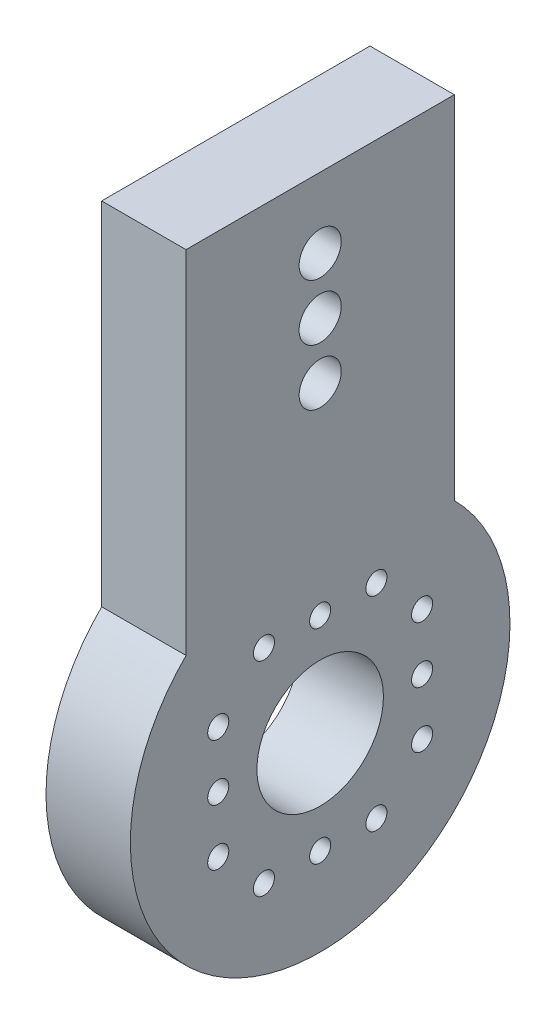
ISO-10303-21;
HEADER;
FILE_DESCRIPTION(('STEP AP214'),'2;1');
FILE_NAME('part.step','',(''),(''),'','','');
FILE_SCHEMA(('AUTOMOTIVE_DESIGN { 1 0 10303 214 1 1 1 1 }'));
ENDSEC;
DATA;
#1=APPLICATION_CONTEXT('core data for automotive mechanical design processes');
#2=APPLICATION_PROTOCOL_DEFINITION('international standard','automotive_design',2000,#1);
#3=PRODUCT_CONTEXT('',#1,'mechanical');
#4=PRODUCT('Part','Part','',(#3));
#5=PRODUCT_RELATED_PRODUCT_CATEGORY('part','',(#4));
#6=PRODUCT_DEFINITION_FORMATION('','',#4);
#7=PRODUCT_DEFINITION_CONTEXT('part definition',#1,'design');
#8=PRODUCT_DEFINITION('design','',#6,#7);
#9=PRODUCT_DEFINITION_SHAPE('','',#8);
#10=(LENGTH_UNIT() NAMED_UNIT(*) SI_UNIT(.MILLI.,.METRE.));
#11=(NAMED_UNIT(*) PLANE_ANGLE_UNIT() SI_UNIT($,.RADIAN.));
#12=(NAMED_UNIT(*) SI_UNIT($,.STERADIAN.) SOLID_ANGLE_UNIT());
#13=UNCERTAINTY_MEASURE_WITH_UNIT(LENGTH_MEASURE(1.E-05),#10,'distance_accuracy_value','');
#14=(GEOMETRIC_REPRESENTATION_CONTEXT(3) GLOBAL_UNCERTAINTY_ASSIGNED_CONTEXT((#13)) GLOBAL_UNIT_ASSIGNED_CONTEXT((#10,
#11,#12)) REPRESENTATION_CONTEXT('',''));
#15=CARTESIAN_POINT('',(0.,0.,0.));
#16=DIRECTION('',(0.,0.,1.));
#17=DIRECTION('',(1.,0.,0.));
#18=AXIS2_PLACEMENT_3D('',#15,#16,#17);
#19=CARTESIAN_POINT('',(6.,0.,0.));
#20=DIRECTION('',(1.,0.,0.));
#21=DIRECTION('',(0.,0.,-1.));
#22=AXIS2_PLACEMENT_3D('',#19,#20,#21);
#23=PLANE('',#22);
#24=CARTESIAN_POINT('',(6.,29.5493078475499,0.));
#25=DIRECTION('',(1.,0.,0.));
#26=DIRECTION('',(0.,0.,-1.));
#27=AXIS2_PLACEMENT_3D('',#24,#25,#26);
#28=CIRCLE('',#27,1.5);
#29=CARTESIAN_POINT('',(6.,29.5493078475499,-1.5));
#30=VERTEX_POINT('',#29);
#31=EDGE_CURVE('E196',#30,#30,#28,.T.);
#32=ORIENTED_EDGE('',*,*,#31,.F.);
#33=EDGE_LOOP('',(#32));
#34=FACE_BOUND('',#33,.T.);
#35=CARTESIAN_POINT('',(6.,-4.00000000000003,7.24999999999999));
#36=DIRECTION('',(1.,0.,0.));
#37=DIRECTION('',(0.,0.,-1.));
#38=AXIS2_PLACEMENT_3D('',#35,#36,#37);
#39=CIRCLE('',#38,0.750000000000001);
#40=CARTESIAN_POINT('',(6.,-4.00000000000003,6.49999999999998));
#41=VERTEX_POINT('',#40);
#42=EDGE_CURVE('E190',#41,#41,#39,.T.);
#43=ORIENTED_EDGE('',*,*,#42,.F.);
#44=EDGE_LOOP('',(#43));
#45=FACE_BOUND('',#44,.T.);
#46=CARTESIAN_POINT('',(6.,3.99999999999997,7.25000000000002));
#47=DIRECTION('',(1.,0.,0.));
#48=DIRECTION('',(0.,0.,-1.));
#49=AXIS2_PLACEMENT_3D('',#46,#47,#48);
#50=CIRCLE('',#49,0.750000000000001);
#51=CARTESIAN_POINT('',(6.,3.99999999999997,6.50000000000002));
#52=VERTEX_POINT('',#51);
#53=EDGE_CURVE('E172',#52,#52,#50,.T.);
#54=ORIENTED_EDGE('',*,*,#53,.F.);
#55=EDGE_LOOP('',(#54));
#56=FACE_BOUND('',#55,.T.);
#57=CARTESIAN_POINT('',(6.,0.,-7.25));
#58=DIRECTION('',(1.,0.,0.));
#59=DIRECTION('',(0.,0.,-1.));
#60=AXIS2_PLACEMENT_3D('',#57,#58,#59);
#61=CIRCLE('',#60,0.749999999999999);
#62=CARTESIAN_POINT('',(6.,0.,-8.));
#63=VERTEX_POINT('',#62);
#64=EDGE_CURVE('E165',#63,#63,#61,.T.);
#65=ORIENTED_EDGE('',*,*,#64,.F.);
#66=EDGE_LOOP('',(#65));
#67=FACE_BOUND('',#66,.T.);
#68=CARTESIAN_POINT('',(6.,-7.25,4.));
#69=DIRECTION('',(1.,0.,0.));
#70=DIRECTION('',(0.,0.,1.));
#71=AXIS2_PLACEMENT_3D('',#68,#69,#70);
#72=CIRCLE('',#71,0.75);
#73=CARTESIAN_POINT('',(6.,-7.25,4.75));
#74=VERTEX_POINT('',#73);
#75=EDGE_CURVE('E152',#74,#74,#72,.T.);
#76=ORIENTED_EDGE('',*,*,#75,.F.);
#77=EDGE_LOOP('',(#76));
#78=FACE_BOUND('',#77,.T.);
#79=CARTESIAN_POINT('',(6.,-7.25,-4.));
#80=DIRECTION('',(1.,0.,0.));
#81=DIRECTION('',(0.,0.,1.));
#82=AXIS2_PLACEMENT_3D('',#79,#80,#81);
#83=CIRCLE('',#82,0.75);
#84=CARTESIAN_POINT('',(6.,-7.25,-3.25));
#85=VERTEX_POINT('',#84);
#86=EDGE_CURVE('E137',#85,#85,#83,.T.);
#87=ORIENTED_EDGE('',*,*,#86,.F.);
#88=EDGE_LOOP('',(#87));
#89=FACE_BOUND('',#88,.T.);
#90=CARTESIAN_POINT('',(6.,7.25,-4.));
#91=DIRECTION('',(1.,0.,0.));
#92=DIRECTION('',(0.,0.,-1.));
#93=AXIS2_PLACEMENT_3D('',#90,#91,#92);
#94=CIRCLE('',#93,0.75);
#95=CARTESIAN_POINT('',(6.,7.25,-4.75));
#96=VERTEX_POINT('',#95);
#97=EDGE_CURVE('E130',#96,#96,#94,.T.);
#98=ORIENTED_EDGE('',*,*,#97,.F.);
#99=EDGE_LOOP('',(#98));
#100=FACE_BOUND('',#99,.T.);
#101=CARTESIAN_POINT('',(6.,0.,0.));
#102=DIRECTION('',(1.,0.,0.));
#103=DIRECTION('',(0.,0.,-1.));
#104=AXIS2_PLACEMENT_3D('',#101,#102,#103);
#105=CIRCLE('',#104,4.5);
#106=CARTESIAN_POINT('',(6.,0.,-4.5));
#107=VERTEX_POINT('',#106);
#108=EDGE_CURVE('E107',#107,#107,#105,.T.);
#109=ORIENTED_EDGE('',*,*,#108,.F.);
#110=EDGE_LOOP('',(#109));
#111=FACE_BOUND('',#110,.T.);
#112=CARTESIAN_POINT('',(6.,0.,0.));
#113=DIRECTION('',(1.,0.,0.));
#114=DIRECTION('',(0.,0.,-1.));
#115=AXIS2_PLACEMENT_3D('',#112,#113,#114);
#116=CIRCLE('',#115,13.5);
#117=CARTESIAN_POINT('',(6.,9.54930784754992,9.54257405696814));
#118=VERTEX_POINT('',#117);
#119=CARTESIAN_POINT('',(6.,9.54930784754992,-9.54257405696814));
#120=VERTEX_POINT('',#119);
#121=EDGE_CURVE('E91',#118,#120,#116,.T.);
#122=ORIENTED_EDGE('',*,*,#121,.T.);
#123=DIRECTION('',(0.,1.,0.));
#124=VECTOR('',#123,1.);
#125=CARTESIAN_POINT('',(6.,9.54930784754992,-9.54257405696814));
#126=LINE('',#125,#124);
#127=CARTESIAN_POINT('',(6.,34.5493078475499,-9.54257405696814));
#128=VERTEX_POINT('',#127);
#129=EDGE_CURVE('E86',#120,#128,#126,.T.);
#130=ORIENTED_EDGE('',*,*,#129,.T.);
#131=DIRECTION('',(0.,0.,1.));
#132=VECTOR('',#131,1.);
#133=CARTESIAN_POINT('',(6.,34.5493078475499,9.54257405696814));
#134=LINE('',#133,#132);
#135=CARTESIAN_POINT('',(6.,34.5493078475499,9.54257405696814));
#136=VERTEX_POINT('',#135);
#137=EDGE_CURVE('E87',#128,#136,#134,.T.);
#138=ORIENTED_EDGE('',*,*,#137,.T.);
#139=DIRECTION('',(0.,-1.,0.));
#140=VECTOR('',#139,1.);
#141=CARTESIAN_POINT('',(6.,9.54930784754992,9.54257405696814));
#142=LINE('',#141,#140);
#143=EDGE_CURVE('E57',#136,#118,#142,.T.);
#144=ORIENTED_EDGE('',*,*,#143,.T.);
#145=EDGE_LOOP('',(#122,#130,#138,#144));
#146=FACE_BOUND('',#145,.T.);
#147=CARTESIAN_POINT('',(6.,7.25,0.));
#148=DIRECTION('',(1.,0.,0.));
#149=DIRECTION('',(0.,0.,-1.));
#150=AXIS2_PLACEMENT_3D('',#147,#148,#149);
#151=CIRCLE('',#150,0.75);
#152=CARTESIAN_POINT('',(6.,7.25,-0.75));
#153=VERTEX_POINT('',#152);
#154=EDGE_CURVE('E123',#153,#153,#151,.T.);
#155=ORIENTED_EDGE('',*,*,#154,.F.);
#156=EDGE_LOOP('',(#155));
#157=FACE_BOUND('',#156,.T.);
#158=CARTESIAN_POINT('',(6.,7.25,4.));
#159=DIRECTION('',(1.,0.,0.));
#160=DIRECTION('',(0.,0.,-1.));
#161=AXIS2_PLACEMENT_3D('',#158,#159,#160);
#162=CIRCLE('',#161,0.75);
#163=CARTESIAN_POINT('',(6.,7.25,3.25));
#164=VERTEX_POINT('',#163);
#165=EDGE_CURVE('E133',#164,#164,#162,.T.);
#166=ORIENTED_EDGE('',*,*,#165,.F.);
#167=EDGE_LOOP('',(#166));
#168=FACE_BOUND('',#167,.T.);
#169=CARTESIAN_POINT('',(6.,-7.25,0.));
#170=DIRECTION('',(1.,0.,0.));
#171=DIRECTION('',(0.,0.,1.));
#172=AXIS2_PLACEMENT_3D('',#169,#170,#171);
#173=CIRCLE('',#172,0.75);
#174=CARTESIAN_POINT('',(6.,-7.25,0.75));
#175=VERTEX_POINT('',#174);
#176=EDGE_CURVE('E144',#175,#175,#173,.T.);
#177=ORIENTED_EDGE('',*,*,#176,.F.);
#178=EDGE_LOOP('',(#177));
#179=FACE_BOUND('',#178,.T.);
#180=CARTESIAN_POINT('',(6.,-3.99999999999992,-7.25000000000004));
#181=DIRECTION('',(1.,0.,0.));
#182=DIRECTION('',(0.,0.,-1.));
#183=AXIS2_PLACEMENT_3D('',#180,#181,#182);
#184=CIRCLE('',#183,0.750000000000001);
#185=CARTESIAN_POINT('',(6.,-3.99999999999992,-8.00000000000004));
#186=VERTEX_POINT('',#185);
#187=EDGE_CURVE('E160',#186,#186,#184,.T.);
#188=ORIENTED_EDGE('',*,*,#187,.F.);
#189=EDGE_LOOP('',(#188));
#190=FACE_BOUND('',#189,.T.);
#191=CARTESIAN_POINT('',(6.,4.00000000000008,-7.24999999999996));
#192=DIRECTION('',(1.,0.,0.));
#193=DIRECTION('',(0.,0.,-1.));
#194=AXIS2_PLACEMENT_3D('',#191,#192,#193);
#195=CIRCLE('',#194,0.750000000000002);
#196=CARTESIAN_POINT('',(6.,4.00000000000008,-7.99999999999996));
#197=VERTEX_POINT('',#196);
#198=EDGE_CURVE('E170',#197,#197,#195,.T.);
#199=ORIENTED_EDGE('',*,*,#198,.F.);
#200=EDGE_LOOP('',(#199));
#201=FACE_BOUND('',#200,.T.);
#202=CARTESIAN_POINT('',(6.,0.,7.25));
#203=DIRECTION('',(1.,0.,0.));
#204=DIRECTION('',(0.,0.,-1.));
#205=AXIS2_PLACEMENT_3D('',#202,#203,#204);
#206=CIRCLE('',#205,0.75);
#207=CARTESIAN_POINT('',(6.,0.,6.5));
#208=VERTEX_POINT('',#207);
#209=EDGE_CURVE('E181',#208,#208,#206,.T.);
#210=ORIENTED_EDGE('',*,*,#209,.F.);
#211=EDGE_LOOP('',(#210));
#212=FACE_BOUND('',#211,.T.);
#213=CARTESIAN_POINT('',(6.,25.5493078475499,0.));
#214=DIRECTION('',(1.,0.,0.));
#215=DIRECTION('',(0.,0.,-1.));
#216=AXIS2_PLACEMENT_3D('',#213,#214,#215);
#217=CIRCLE('',#216,1.5);
#218=CARTESIAN_POINT('',(6.,25.5493078475499,-1.5));
#219=VERTEX_POINT('',#218);
#220=EDGE_CURVE('E194',#219,#219,#217,.T.);
#221=ORIENTED_EDGE('',*,*,#220,.F.);
#222=EDGE_LOOP('',(#221));
#223=FACE_BOUND('',#222,.T.);
#224=CARTESIAN_POINT('',(6.,21.5493078475499,0.));
#225=DIRECTION('',(1.,0.,0.));
#226=DIRECTION('',(0.,0.,-1.));
#227=AXIS2_PLACEMENT_3D('',#224,#225,#226);
#228=CIRCLE('',#227,1.49825445420867);
#229=CARTESIAN_POINT('',(6.,21.5493078475499,-1.49825445420867));
#230=VERTEX_POINT('',#229);
#231=EDGE_CURVE('E203',#230,#230,#228,.T.);
#232=ORIENTED_EDGE('',*,*,#231,.F.);
#233=EDGE_LOOP('',(#232));
#234=FACE_BOUND('',#233,.T.);
#235=ADVANCED_FACE('F39',(#34,#45,#56,#67,#78,#89,#100,#111,#146,#157,#168,#179,#190,#201,#212,
#223,#234),#23,.T.);
#236=CARTESIAN_POINT('',(0.,0.,0.));
#237=DIRECTION('',(1.,0.,0.));
#238=DIRECTION('',(0.,0.,-1.));
#239=AXIS2_PLACEMENT_3D('',#236,#237,#238);
#240=PLANE('',#239);
#241=CARTESIAN_POINT('',(0.,0.,0.));
#242=DIRECTION('',(1.,0.,0.));
#243=DIRECTION('',(0.,0.,-1.));
#244=AXIS2_PLACEMENT_3D('',#241,#242,#243);
#245=CIRCLE('',#244,13.5);
#246=CARTESIAN_POINT('',(0.,9.54930784754992,9.54257405696814));
#247=VERTEX_POINT('',#246);
#248=CARTESIAN_POINT('',(0.,9.54930784754992,-9.54257405696814));
#249=VERTEX_POINT('',#248);
#250=EDGE_CURVE('E104',#247,#249,#245,.T.);
#251=ORIENTED_EDGE('',*,*,#250,.F.);
#252=DIRECTION('',(0.,-1.,0.));
#253=VECTOR('',#252,1.);
#254=CARTESIAN_POINT('',(0.,9.54930784754992,9.54257405696814));
#255=LINE('',#254,#253);
#256=CARTESIAN_POINT('',(0.,34.5493078475499,9.54257405696814));
#257=VERTEX_POINT('',#256);
#258=EDGE_CURVE('E80',#257,#247,#255,.T.);
#259=ORIENTED_EDGE('',*,*,#258,.F.);
#260=DIRECTION('',(0.,0.,1.));
#261=VECTOR('',#260,1.);
#262=CARTESIAN_POINT('',(0.,34.5493078475499,9.54257405696814));
#263=LINE('',#262,#261);
#264=CARTESIAN_POINT('',(0.,34.5493078475499,-9.54257405696814));
#265=VERTEX_POINT('',#264);
#266=EDGE_CURVE('E75',#265,#257,#263,.T.);
#267=ORIENTED_EDGE('',*,*,#266,.F.);
#268=DIRECTION('',(0.,1.,0.));
#269=VECTOR('',#268,1.);
#270=CARTESIAN_POINT('',(0.,9.54930784754992,-9.54257405696814));
#271=LINE('',#270,#269);
#272=EDGE_CURVE('E94',#249,#265,#271,.T.);
#273=ORIENTED_EDGE('',*,*,#272,.F.);
#274=EDGE_LOOP('',(#251,#259,#267,#273));
#275=FACE_BOUND('',#274,.T.);
#276=CARTESIAN_POINT('',(0.,0.,0.));
#277=DIRECTION('',(1.,0.,0.));
#278=DIRECTION('',(0.,0.,-1.));
#279=AXIS2_PLACEMENT_3D('',#276,#277,#278);
#280=CIRCLE('',#279,4.5);
#281=CARTESIAN_POINT('',(0.,0.,-4.5));
#282=VERTEX_POINT('',#281);
#283=EDGE_CURVE('E120',#282,#282,#280,.T.);
#284=ORIENTED_EDGE('',*,*,#283,.T.);
#285=EDGE_LOOP('',(#284));
#286=FACE_BOUND('',#285,.T.);
#287=CARTESIAN_POINT('',(0.,7.25,0.));
#288=DIRECTION('',(1.,0.,0.));
#289=DIRECTION('',(0.,0.,-1.));
#290=AXIS2_PLACEMENT_3D('',#287,#288,#289);
#291=CIRCLE('',#290,0.75);
#292=CARTESIAN_POINT('',(0.,7.25,-0.75));
#293=VERTEX_POINT('',#292);
#294=EDGE_CURVE('E125',#293,#293,#291,.T.);
#295=ORIENTED_EDGE('',*,*,#294,.T.);
#296=EDGE_LOOP('',(#295));
#297=FACE_BOUND('',#296,.T.);
#298=CARTESIAN_POINT('',(0.,7.25,-4.));
#299=DIRECTION('',(1.,0.,0.));
#300=DIRECTION('',(0.,0.,-1.));
#301=AXIS2_PLACEMENT_3D('',#298,#299,#300);
#302=CIRCLE('',#301,0.75);
#303=CARTESIAN_POINT('',(0.,7.25,-4.75));
#304=VERTEX_POINT('',#303);
#305=EDGE_CURVE('E127',#304,#304,#302,.T.);
#306=ORIENTED_EDGE('',*,*,#305,.T.);
#307=EDGE_LOOP('',(#306));
#308=FACE_BOUND('',#307,.T.);
#309=CARTESIAN_POINT('',(0.,7.25,4.));
#310=DIRECTION('',(1.,0.,0.));
#311=DIRECTION('',(0.,0.,-1.));
#312=AXIS2_PLACEMENT_3D('',#309,#310,#311);
#313=CIRCLE('',#312,0.75);
#314=CARTESIAN_POINT('',(0.,7.25,3.25));
#315=VERTEX_POINT('',#314);
#316=EDGE_CURVE('E136',#315,#315,#313,.T.);
#317=ORIENTED_EDGE('',*,*,#316,.T.);
#318=EDGE_LOOP('',(#317));
#319=FACE_BOUND('',#318,.T.);
#320=CARTESIAN_POINT('',(0.,-7.25,-4.));
#321=DIRECTION('',(1.,0.,0.));
#322=DIRECTION('',(0.,0.,1.));
#323=AXIS2_PLACEMENT_3D('',#320,#321,#322);
#324=CIRCLE('',#323,0.75);
#325=CARTESIAN_POINT('',(0.,-7.25,-3.25));
#326=VERTEX_POINT('',#325);
#327=EDGE_CURVE('E145',#326,#326,#324,.T.);
#328=ORIENTED_EDGE('',*,*,#327,.T.);
#329=EDGE_LOOP('',(#328));
#330=FACE_BOUND('',#329,.T.);
#331=CARTESIAN_POINT('',(0.,-7.25,0.));
#332=DIRECTION('',(1.,0.,0.));
#333=DIRECTION('',(0.,0.,1.));
#334=AXIS2_PLACEMENT_3D('',#331,#332,#333);
#335=CIRCLE('',#334,0.75);
#336=CARTESIAN_POINT('',(0.,-7.25,0.75));
#337=VERTEX_POINT('',#336);
#338=EDGE_CURVE('E149',#337,#337,#335,.T.);
#339=ORIENTED_EDGE('',*,*,#338,.T.);
#340=EDGE_LOOP('',(#339));
#341=FACE_BOUND('',#340,.T.);
#342=CARTESIAN_POINT('',(0.,-7.25,4.));
#343=DIRECTION('',(1.,0.,0.));
#344=DIRECTION('',(0.,0.,1.));
#345=AXIS2_PLACEMENT_3D('',#342,#343,#344);
#346=CIRCLE('',#345,0.75);
#347=CARTESIAN_POINT('',(0.,-7.25,4.75));
#348=VERTEX_POINT('',#347);
#349=EDGE_CURVE('E151',#348,#348,#346,.T.);
#350=ORIENTED_EDGE('',*,*,#349,.T.);
#351=EDGE_LOOP('',(#350));
#352=FACE_BOUND('',#351,.T.);
#353=CARTESIAN_POINT('',(0.,-3.99999999999992,-7.25000000000004));
#354=DIRECTION('',(1.,0.,0.));
#355=DIRECTION('',(0.,0.,-1.));
#356=AXIS2_PLACEMENT_3D('',#353,#354,#355);
#357=CIRCLE('',#356,0.750000000000001);
#358=CARTESIAN_POINT('',(0.,-3.99999999999992,-8.00000000000004));
#359=VERTEX_POINT('',#358);
#360=EDGE_CURVE('E158',#359,#359,#357,.T.);
#361=ORIENTED_EDGE('',*,*,#360,.T.);
#362=EDGE_LOOP('',(#361));
#363=FACE_BOUND('',#362,.T.);
#364=CARTESIAN_POINT('',(0.,0.,-7.25));
#365=DIRECTION('',(1.,0.,0.));
#366=DIRECTION('',(0.,0.,-1.));
#367=AXIS2_PLACEMENT_3D('',#364,#365,#366);
#368=CIRCLE('',#367,0.749999999999999);
#369=CARTESIAN_POINT('',(0.,0.,-8.));
#370=VERTEX_POINT('',#369);
#371=EDGE_CURVE('E168',#370,#370,#368,.T.);
#372=ORIENTED_EDGE('',*,*,#371,.T.);
#373=EDGE_LOOP('',(#372));
#374=FACE_BOUND('',#373,.T.);
#375=CARTESIAN_POINT('',(0.,4.00000000000008,-7.24999999999996));
#376=DIRECTION('',(1.,0.,0.));
#377=DIRECTION('',(0.,0.,-1.));
#378=AXIS2_PLACEMENT_3D('',#375,#376,#377);
#379=CIRCLE('',#378,0.750000000000002);
#380=CARTESIAN_POINT('',(0.,4.00000000000008,-7.99999999999996));
#381=VERTEX_POINT('',#380);
#382=EDGE_CURVE('E175',#381,#381,#379,.T.);
#383=ORIENTED_EDGE('',*,*,#382,.T.);
#384=EDGE_LOOP('',(#383));
#385=FACE_BOUND('',#384,.T.);
#386=CARTESIAN_POINT('',(0.,3.99999999999997,7.25000000000002));
#387=DIRECTION('',(1.,0.,0.));
#388=DIRECTION('',(0.,0.,-1.));
#389=AXIS2_PLACEMENT_3D('',#386,#387,#388);
#390=CIRCLE('',#389,0.750000000000001);
#391=CARTESIAN_POINT('',(0.,3.99999999999997,6.50000000000002));
#392=VERTEX_POINT('',#391);
#393=EDGE_CURVE('E178',#392,#392,#390,.T.);
#394=ORIENTED_EDGE('',*,*,#393,.T.);
#395=EDGE_LOOP('',(#394));
#396=FACE_BOUND('',#395,.T.);
#397=CARTESIAN_POINT('',(0.,0.,7.25));
#398=DIRECTION('',(1.,0.,0.));
#399=DIRECTION('',(0.,0.,-1.));
#400=AXIS2_PLACEMENT_3D('',#397,#398,#399);
#401=CIRCLE('',#400,0.75);
#402=CARTESIAN_POINT('',(0.,0.,6.5));
#403=VERTEX_POINT('',#402);
#404=EDGE_CURVE('E182',#403,#403,#401,.T.);
#405=ORIENTED_EDGE('',*,*,#404,.T.);
#406=EDGE_LOOP('',(#405));
#407=FACE_BOUND('',#406,.T.);
#408=CARTESIAN_POINT('',(0.,-4.00000000000003,7.24999999999999));
#409=DIRECTION('',(1.,0.,0.));
#410=DIRECTION('',(0.,0.,-1.));
#411=AXIS2_PLACEMENT_3D('',#408,#409,#410);
#412=CIRCLE('',#411,0.750000000000001);
#413=CARTESIAN_POINT('',(0.,-4.00000000000003,6.49999999999998));
#414=VERTEX_POINT('',#413);
#415=EDGE_CURVE('E189',#414,#414,#412,.T.);
#416=ORIENTED_EDGE('',*,*,#415,.T.);
#417=EDGE_LOOP('',(#416));
#418=FACE_BOUND('',#417,.T.);
#419=CARTESIAN_POINT('',(0.,25.5493078475499,0.));
#420=DIRECTION('',(1.,0.,0.));
#421=DIRECTION('',(0.,0.,-1.));
#422=AXIS2_PLACEMENT_3D('',#419,#420,#421);
#423=CIRCLE('',#422,1.5);
#424=CARTESIAN_POINT('',(0.,25.5493078475499,-1.5));
#425=VERTEX_POINT('',#424);
#426=EDGE_CURVE('E197',#425,#425,#423,.T.);
#427=ORIENTED_EDGE('',*,*,#426,.T.);
#428=EDGE_LOOP('',(#427));
#429=FACE_BOUND('',#428,.T.);
#430=CARTESIAN_POINT('',(0.,29.5493078475499,0.));
#431=DIRECTION('',(1.,0.,0.));
#432=DIRECTION('',(0.,0.,-1.));
#433=AXIS2_PLACEMENT_3D('',#430,#431,#432);
#434=CIRCLE('',#433,1.5);
#435=CARTESIAN_POINT('',(0.,29.5493078475499,-1.5));
#436=VERTEX_POINT('',#435);
#437=EDGE_CURVE('E205',#436,#436,#434,.T.);
#438=ORIENTED_EDGE('',*,*,#437,.T.);
#439=EDGE_LOOP('',(#438));
#440=FACE_BOUND('',#439,.T.);
#441=CARTESIAN_POINT('',(0.,21.5493078475499,0.));
#442=DIRECTION('',(1.,0.,0.));
#443=DIRECTION('',(0.,0.,-1.));
#444=AXIS2_PLACEMENT_3D('',#441,#442,#443);
#445=CIRCLE('',#444,1.49825445420867);
#446=CARTESIAN_POINT('',(0.,21.5493078475499,-1.49825445420867));
#447=VERTEX_POINT('',#446);
#448=EDGE_CURVE('E210',#447,#447,#445,.T.);
#449=ORIENTED_EDGE('',*,*,#448,.T.);
#450=EDGE_LOOP('',(#449));
#451=FACE_BOUND('',#450,.T.);
#452=ADVANCED_FACE('F114',(#275,#286,#297,#308,#319,#330,#341,#352,#363,#374,#385,#396,#407,
#418,#429,#440,#451),#240,.F.);
#453=CARTESIAN_POINT('',(6.,0.,0.));
#454=DIRECTION('',(-1.,0.,0.));
#455=DIRECTION('',(0.,0.,1.));
#456=AXIS2_PLACEMENT_3D('',#453,#454,#455);
#457=CYLINDRICAL_SURFACE('',#456,13.5);
#458=ORIENTED_EDGE('',*,*,#250,.T.);
#459=DIRECTION('',(-1.,0.,0.));
#460=VECTOR('',#459,1.);
#461=CARTESIAN_POINT('',(6.,9.54930784754992,-9.54257405696814));
#462=LINE('',#461,#460);
#463=EDGE_CURVE('E11',#120,#249,#462,.T.);
#464=ORIENTED_EDGE('',*,*,#463,.F.);
#465=ORIENTED_EDGE('',*,*,#121,.F.);
#466=DIRECTION('',(-1.,0.,0.));
#467=VECTOR('',#466,1.);
#468=CARTESIAN_POINT('',(6.,9.54930784754992,9.54257405696814));
#469=LINE('',#468,#467);
#470=EDGE_CURVE('E98',#118,#247,#469,.T.);
#471=ORIENTED_EDGE('',*,*,#470,.T.);
#472=EDGE_LOOP('',(#458,#464,#465,#471));
#473=FACE_BOUND('',#472,.T.);
#474=ADVANCED_FACE('F41',(#473),#457,.T.);
#475=CARTESIAN_POINT('',(6.,9.54930784754992,-9.54257405696814));
#476=DIRECTION('',(0.,0.,1.));
#477=DIRECTION('',(1.,0.,0.));
#478=AXIS2_PLACEMENT_3D('',#475,#476,#477);
#479=PLANE('',#478);
#480=ORIENTED_EDGE('',*,*,#272,.T.);
#481=DIRECTION('',(-1.,0.,0.));
#482=VECTOR('',#481,1.);
#483=CARTESIAN_POINT('',(6.,34.5493078475499,-9.54257405696814));
#484=LINE('',#483,#482);
#485=EDGE_CURVE('E48',#128,#265,#484,.T.);
#486=ORIENTED_EDGE('',*,*,#485,.F.);
#487=ORIENTED_EDGE('',*,*,#129,.F.);
#488=ORIENTED_EDGE('',*,*,#463,.T.);
#489=EDGE_LOOP('',(#480,#486,#487,#488));
#490=FACE_BOUND('',#489,.T.);
#491=ADVANCED_FACE('F92',(#490),#479,.F.);
#492=CARTESIAN_POINT('',(6.,34.5493078475499,9.54257405696814));
#493=DIRECTION('',(0.,-1.,0.));
#494=DIRECTION('',(0.,0.,-1.));
#495=AXIS2_PLACEMENT_3D('',#492,#493,#494);
#496=PLANE('',#495);
#497=ORIENTED_EDGE('',*,*,#266,.T.);
#498=DIRECTION('',(-1.,0.,0.));
#499=VECTOR('',#498,1.);
#500=CARTESIAN_POINT('',(6.,34.5493078475499,9.54257405696814));
#501=LINE('',#500,#499);
#502=EDGE_CURVE('E96',#136,#257,#501,.T.);
#503=ORIENTED_EDGE('',*,*,#502,.F.);
#504=ORIENTED_EDGE('',*,*,#137,.F.);
#505=ORIENTED_EDGE('',*,*,#485,.T.);
#506=EDGE_LOOP('',(#497,#503,#504,#505));
#507=FACE_BOUND('',#506,.T.);
#508=ADVANCED_FACE('F100',(#507),#496,.F.);
#509=CARTESIAN_POINT('',(6.,9.54930784754992,9.54257405696814));
#510=DIRECTION('',(0.,0.,-1.));
#511=DIRECTION('',(-1.,0.,0.));
#512=AXIS2_PLACEMENT_3D('',#509,#510,#511);
#513=PLANE('',#512);
#514=ORIENTED_EDGE('',*,*,#258,.T.);
#515=ORIENTED_EDGE('',*,*,#470,.F.);
#516=ORIENTED_EDGE('',*,*,#143,.F.);
#517=ORIENTED_EDGE('',*,*,#502,.T.);
#518=EDGE_LOOP('',(#514,#515,#516,#517));
#519=FACE_BOUND('',#518,.T.);
#520=ADVANCED_FACE('F112',(#519),#513,.F.);
#521=CARTESIAN_POINT('',(6.,0.,0.));
#522=DIRECTION('',(-1.,0.,0.));
#523=DIRECTION('',(0.,0.,1.));
#524=AXIS2_PLACEMENT_3D('',#521,#522,#523);
#525=CYLINDRICAL_SURFACE('',#524,4.5);
#526=ORIENTED_EDGE('',*,*,#108,.T.);
#527=EDGE_LOOP('',(#526));
#528=FACE_BOUND('',#527,.T.);
#529=ORIENTED_EDGE('',*,*,#283,.F.);
#530=EDGE_LOOP('',(#529));
#531=FACE_BOUND('',#530,.T.);
#532=ADVANCED_FACE('F230',(#528,#531),#525,.F.);
#533=CARTESIAN_POINT('',(6.,7.25,0.));
#534=DIRECTION('',(-1.,0.,0.));
#535=DIRECTION('',(0.,0.,1.));
#536=AXIS2_PLACEMENT_3D('',#533,#534,#535);
#537=CYLINDRICAL_SURFACE('',#536,0.75);
#538=ORIENTED_EDGE('',*,*,#154,.T.);
#539=EDGE_LOOP('',(#538));
#540=FACE_BOUND('',#539,.T.);
#541=ORIENTED_EDGE('',*,*,#294,.F.);
#542=EDGE_LOOP('',(#541));
#543=FACE_BOUND('',#542,.T.);
#544=ADVANCED_FACE('F275',(#540,#543),#537,.F.);
#545=CARTESIAN_POINT('',(6.,7.25,-4.));
#546=DIRECTION('',(-1.,0.,0.));
#547=DIRECTION('',(0.,0.,1.));
#548=AXIS2_PLACEMENT_3D('',#545,#546,#547);
#549=CYLINDRICAL_SURFACE('',#548,0.75);
#550=ORIENTED_EDGE('',*,*,#97,.T.);
#551=EDGE_LOOP('',(#550));
#552=FACE_BOUND('',#551,.T.);
#553=ORIENTED_EDGE('',*,*,#305,.F.);
#554=EDGE_LOOP('',(#553));
#555=FACE_BOUND('',#554,.T.);
#556=ADVANCED_FACE('F279',(#552,#555),#549,.F.);
#557=CARTESIAN_POINT('',(6.,7.25,4.));
#558=DIRECTION('',(-1.,0.,0.));
#559=DIRECTION('',(0.,0.,1.));
#560=AXIS2_PLACEMENT_3D('',#557,#558,#559);
#561=CYLINDRICAL_SURFACE('',#560,0.75);
#562=ORIENTED_EDGE('',*,*,#165,.T.);
#563=EDGE_LOOP('',(#562));
#564=FACE_BOUND('',#563,.T.);
#565=ORIENTED_EDGE('',*,*,#316,.F.);
#566=EDGE_LOOP('',(#565));
#567=FACE_BOUND('',#566,.T.);
#568=ADVANCED_FACE('F290',(#564,#567),#561,.F.);
#569=CARTESIAN_POINT('',(6.,-7.25,-4.));
#570=DIRECTION('',(-1.,0.,0.));
#571=DIRECTION('',(0.,0.,1.));
#572=AXIS2_PLACEMENT_3D('',#569,#570,#571);
#573=CYLINDRICAL_SURFACE('',#572,0.75);
#574=ORIENTED_EDGE('',*,*,#86,.T.);
#575=EDGE_LOOP('',(#574));
#576=FACE_BOUND('',#575,.T.);
#577=ORIENTED_EDGE('',*,*,#327,.F.);
#578=EDGE_LOOP('',(#577));
#579=FACE_BOUND('',#578,.T.);
#580=ADVANCED_FACE('F299',(#576,#579),#573,.F.);
#581=CARTESIAN_POINT('',(6.,-7.25,0.));
#582=DIRECTION('',(-1.,0.,0.));
#583=DIRECTION('',(0.,0.,1.));
#584=AXIS2_PLACEMENT_3D('',#581,#582,#583);
#585=CYLINDRICAL_SURFACE('',#584,0.75);
#586=ORIENTED_EDGE('',*,*,#176,.T.);
#587=EDGE_LOOP('',(#586));
#588=FACE_BOUND('',#587,.T.);
#589=ORIENTED_EDGE('',*,*,#338,.F.);
#590=EDGE_LOOP('',(#589));
#591=FACE_BOUND('',#590,.T.);
#592=ADVANCED_FACE('F308',(#588,#591),#585,.F.);
#593=CARTESIAN_POINT('',(6.,-7.25,4.));
#594=DIRECTION('',(-1.,0.,0.));
#595=DIRECTION('',(0.,0.,1.));
#596=AXIS2_PLACEMENT_3D('',#593,#594,#595);
#597=CYLINDRICAL_SURFACE('',#596,0.75);
#598=ORIENTED_EDGE('',*,*,#75,.T.);
#599=EDGE_LOOP('',(#598));
#600=FACE_BOUND('',#599,.T.);
#601=ORIENTED_EDGE('',*,*,#349,.F.);
#602=EDGE_LOOP('',(#601));
#603=FACE_BOUND('',#602,.T.);
#604=ADVANCED_FACE('F314',(#600,#603),#597,.F.);
#605=CARTESIAN_POINT('',(6.,-3.99999999999992,-7.25000000000004));
#606=DIRECTION('',(-1.,0.,0.));
#607=DIRECTION('',(0.,0.,1.));
#608=AXIS2_PLACEMENT_3D('',#605,#606,#607);
#609=CYLINDRICAL_SURFACE('',#608,0.750000000000001);
#610=ORIENTED_EDGE('',*,*,#187,.T.);
#611=EDGE_LOOP('',(#610));
#612=FACE_BOUND('',#611,.T.);
#613=ORIENTED_EDGE('',*,*,#360,.F.);
#614=EDGE_LOOP('',(#613));
#615=FACE_BOUND('',#614,.T.);
#616=ADVANCED_FACE('F323',(#612,#615),#609,.F.);
#617=CARTESIAN_POINT('',(6.,0.,-7.25));
#618=DIRECTION('',(-1.,0.,0.));
#619=DIRECTION('',(0.,0.,1.));
#620=AXIS2_PLACEMENT_3D('',#617,#618,#619);
#621=CYLINDRICAL_SURFACE('',#620,0.749999999999999);
#622=ORIENTED_EDGE('',*,*,#64,.T.);
#623=EDGE_LOOP('',(#622));
#624=FACE_BOUND('',#623,.T.);
#625=ORIENTED_EDGE('',*,*,#371,.F.);
#626=EDGE_LOOP('',(#625));
#627=FACE_BOUND('',#626,.T.);
#628=ADVANCED_FACE('F335',(#624,#627),#621,.F.);
#629=CARTESIAN_POINT('',(6.,4.00000000000008,-7.24999999999996));
#630=DIRECTION('',(-1.,0.,0.));
#631=DIRECTION('',(0.,0.,1.));
#632=AXIS2_PLACEMENT_3D('',#629,#630,#631);
#633=CYLINDRICAL_SURFACE('',#632,0.750000000000002);
#634=ORIENTED_EDGE('',*,*,#198,.T.);
#635=EDGE_LOOP('',(#634));
#636=FACE_BOUND('',#635,.T.);
#637=ORIENTED_EDGE('',*,*,#382,.F.);
#638=EDGE_LOOP('',(#637));
#639=FACE_BOUND('',#638,.T.);
#640=ADVANCED_FACE('F344',(#636,#639),#633,.F.);
#641=CARTESIAN_POINT('',(6.,3.99999999999997,7.25000000000002));
#642=DIRECTION('',(-1.,0.,0.));
#643=DIRECTION('',(0.,0.,1.));
#644=AXIS2_PLACEMENT_3D('',#641,#642,#643);
#645=CYLINDRICAL_SURFACE('',#644,0.750000000000001);
#646=ORIENTED_EDGE('',*,*,#53,.T.);
#647=EDGE_LOOP('',(#646));
#648=FACE_BOUND('',#647,.T.);
#649=ORIENTED_EDGE('',*,*,#393,.F.);
#650=EDGE_LOOP('',(#649));
#651=FACE_BOUND('',#650,.T.);
#652=ADVANCED_FACE('F353',(#648,#651),#645,.F.);
#653=CARTESIAN_POINT('',(6.,0.,7.25));
#654=DIRECTION('',(-1.,0.,0.));
#655=DIRECTION('',(0.,0.,1.));
#656=AXIS2_PLACEMENT_3D('',#653,#654,#655);
#657=CYLINDRICAL_SURFACE('',#656,0.75);
#658=ORIENTED_EDGE('',*,*,#209,.T.);
#659=EDGE_LOOP('',(#658));
#660=FACE_BOUND('',#659,.T.);
#661=ORIENTED_EDGE('',*,*,#404,.F.);
#662=EDGE_LOOP('',(#661));
#663=FACE_BOUND('',#662,.T.);
#664=ADVANCED_FACE('F359',(#660,#663),#657,.F.);
#665=CARTESIAN_POINT('',(6.,-4.00000000000003,7.24999999999999));
#666=DIRECTION('',(-1.,0.,0.));
#667=DIRECTION('',(0.,0.,1.));
#668=AXIS2_PLACEMENT_3D('',#665,#666,#667);
#669=CYLINDRICAL_SURFACE('',#668,0.750000000000001);
#670=ORIENTED_EDGE('',*,*,#42,.T.);
#671=EDGE_LOOP('',(#670));
#672=FACE_BOUND('',#671,.T.);
#673=ORIENTED_EDGE('',*,*,#415,.F.);
#674=EDGE_LOOP('',(#673));
#675=FACE_BOUND('',#674,.T.);
#676=ADVANCED_FACE('F368',(#672,#675),#669,.F.);
#677=CARTESIAN_POINT('',(6.,25.5493078475499,0.));
#678=DIRECTION('',(-1.,0.,0.));
#679=DIRECTION('',(0.,0.,1.));
#680=AXIS2_PLACEMENT_3D('',#677,#678,#679);
#681=CYLINDRICAL_SURFACE('',#680,1.5);
#682=ORIENTED_EDGE('',*,*,#220,.T.);
#683=EDGE_LOOP('',(#682));
#684=FACE_BOUND('',#683,.T.);
#685=ORIENTED_EDGE('',*,*,#426,.F.);
#686=EDGE_LOOP('',(#685));
#687=FACE_BOUND('',#686,.T.);
#688=ADVANCED_FACE('F380',(#684,#687),#681,.F.);
#689=CARTESIAN_POINT('',(6.,29.5493078475499,0.));
#690=DIRECTION('',(-1.,0.,0.));
#691=DIRECTION('',(0.,0.,1.));
#692=AXIS2_PLACEMENT_3D('',#689,#690,#691);
#693=CYLINDRICAL_SURFACE('',#692,1.5);
#694=ORIENTED_EDGE('',*,*,#31,.T.);
#695=EDGE_LOOP('',(#694));
#696=FACE_BOUND('',#695,.T.);
#697=ORIENTED_EDGE('',*,*,#437,.F.);
#698=EDGE_LOOP('',(#697));
#699=FACE_BOUND('',#698,.T.);
#700=ADVANCED_FACE('F389',(#696,#699),#693,.F.);
#701=CARTESIAN_POINT('',(6.,21.5493078475499,0.));
#702=DIRECTION('',(-1.,0.,0.));
#703=DIRECTION('',(0.,0.,1.));
#704=AXIS2_PLACEMENT_3D('',#701,#702,#703);
#705=CYLINDRICAL_SURFACE('',#704,1.49825445420867);
#706=ORIENTED_EDGE('',*,*,#231,.T.);
#707=EDGE_LOOP('',(#706));
#708=FACE_BOUND('',#707,.T.);
#709=ORIENTED_EDGE('',*,*,#448,.F.);
#710=EDGE_LOOP('',(#709));
#711=FACE_BOUND('',#710,.T.);
#712=ADVANCED_FACE('F215',(#708,#711),#705,.F.);
#713=CLOSED_SHELL('',(#235,#452,#474,#491,#508,#520,#532,#544,#556,#568,#580,#592,#604,#616,
#628,#640,#652,#664,#676,#688,#700,#712));
#714=MANIFOLD_SOLID_BREP('B2',#713);
#715=ADVANCED_BREP_SHAPE_REPRESENTATION('',(#18,#714),#14);
#716=SHAPE_DEFINITION_REPRESENTATION(#9,#715);
ENDSEC;
END-ISO-10303-21;
